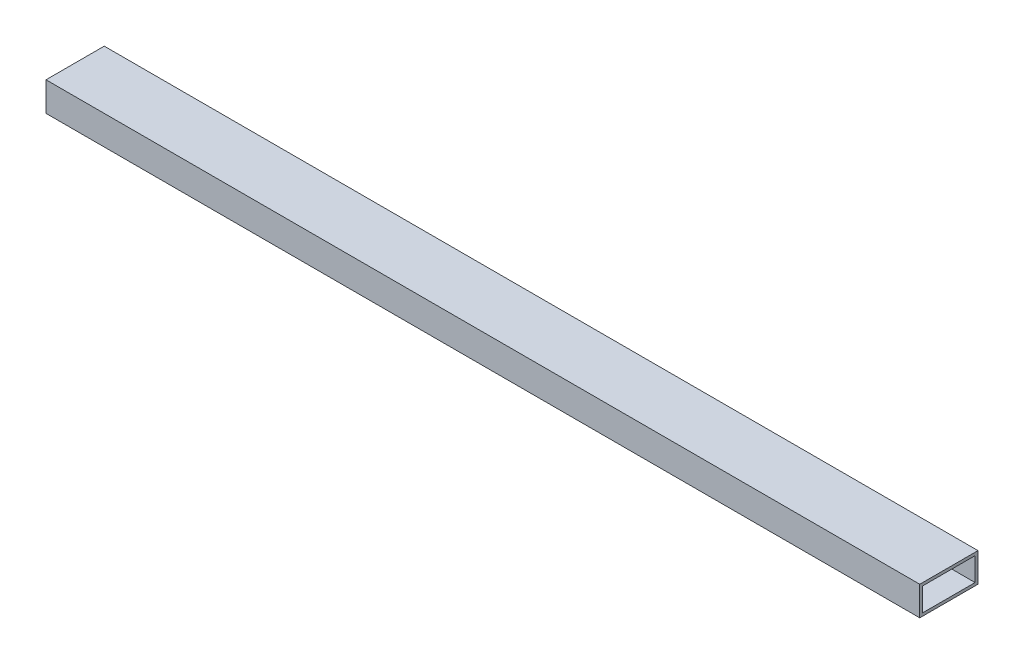
ISO-10303-21;
HEADER;
FILE_DESCRIPTION(('STEP AP214'),'2;1');
FILE_NAME('part.step','',(''),(''),'','','');
FILE_SCHEMA(('AUTOMOTIVE_DESIGN { 1 0 10303 214 1 1 1 1 }'));
ENDSEC;
DATA;
#1=APPLICATION_CONTEXT('core data for automotive mechanical design processes');
#2=APPLICATION_PROTOCOL_DEFINITION('international standard','automotive_design',2000,#1);
#3=PRODUCT_CONTEXT('',#1,'mechanical');
#4=PRODUCT('Part','Part','',(#3));
#5=PRODUCT_RELATED_PRODUCT_CATEGORY('part','',(#4));
#6=PRODUCT_DEFINITION_FORMATION('','',#4);
#7=PRODUCT_DEFINITION_CONTEXT('part definition',#1,'design');
#8=PRODUCT_DEFINITION('design','',#6,#7);
#9=PRODUCT_DEFINITION_SHAPE('','',#8);
#10=(LENGTH_UNIT() NAMED_UNIT(*) SI_UNIT(.MILLI.,.METRE.));
#11=(NAMED_UNIT(*) PLANE_ANGLE_UNIT() SI_UNIT($,.RADIAN.));
#12=(NAMED_UNIT(*) SI_UNIT($,.STERADIAN.) SOLID_ANGLE_UNIT());
#13=UNCERTAINTY_MEASURE_WITH_UNIT(LENGTH_MEASURE(1.E-05),#10,'distance_accuracy_value','');
#14=(GEOMETRIC_REPRESENTATION_CONTEXT(3) GLOBAL_UNCERTAINTY_ASSIGNED_CONTEXT((#13)) GLOBAL_UNIT_ASSIGNED_CONTEXT((#10,
#11,#12)) REPRESENTATION_CONTEXT('',''));
#15=CARTESIAN_POINT('',(0.,0.,0.));
#16=DIRECTION('',(0.,0.,1.));
#17=DIRECTION('',(1.,0.,0.));
#18=AXIS2_PLACEMENT_3D('',#15,#16,#17);
#19=CARTESIAN_POINT('',(300.,0.,0.));
#20=DIRECTION('',(-1.,0.,0.));
#21=DIRECTION('',(0.,0.,1.));
#22=AXIS2_PLACEMENT_3D('',#19,#20,#21);
#23=PLANE('',#22);
#24=DIRECTION('',(0.,1.,0.));
#25=VECTOR('',#24,1.);
#26=CARTESIAN_POINT('',(300.,-5.,-10.));
#27=LINE('',#26,#25);
#28=CARTESIAN_POINT('',(300.,-5.,-10.));
#29=VERTEX_POINT('',#28);
#30=CARTESIAN_POINT('',(300.,5.,-10.));
#31=VERTEX_POINT('',#30);
#32=EDGE_CURVE('E138',#29,#31,#27,.T.);
#33=ORIENTED_EDGE('',*,*,#32,.T.);
#34=DIRECTION('',(0.,0.,1.));
#35=VECTOR('',#34,1.);
#36=CARTESIAN_POINT('',(300.,5.,10.));
#37=LINE('',#36,#35);
#38=CARTESIAN_POINT('',(300.,5.,10.));
#39=VERTEX_POINT('',#38);
#40=EDGE_CURVE('E141',#31,#39,#37,.T.);
#41=ORIENTED_EDGE('',*,*,#40,.T.);
#42=DIRECTION('',(0.,-1.,0.));
#43=VECTOR('',#42,1.);
#44=CARTESIAN_POINT('',(300.,-5.,10.));
#45=LINE('',#44,#43);
#46=CARTESIAN_POINT('',(300.,-5.,10.));
#47=VERTEX_POINT('',#46);
#48=EDGE_CURVE('E144',#39,#47,#45,.T.);
#49=ORIENTED_EDGE('',*,*,#48,.T.);
#50=DIRECTION('',(0.,0.,-1.));
#51=VECTOR('',#50,1.);
#52=CARTESIAN_POINT('',(300.,-5.,10.));
#53=LINE('',#52,#51);
#54=EDGE_CURVE('E146',#47,#29,#53,.T.);
#55=ORIENTED_EDGE('',*,*,#54,.T.);
#56=EDGE_LOOP('',(#33,#41,#49,#55));
#57=FACE_BOUND('',#56,.T.);
#58=DIRECTION('',(0.,-1.,0.));
#59=VECTOR('',#58,1.);
#60=CARTESIAN_POINT('',(300.,-4.,9.));
#61=LINE('',#60,#59);
#62=CARTESIAN_POINT('',(300.,4.,9.));
#63=VERTEX_POINT('',#62);
#64=CARTESIAN_POINT('',(300.,-4.,9.));
#65=VERTEX_POINT('',#64);
#66=EDGE_CURVE('E102',#63,#65,#61,.T.);
#67=ORIENTED_EDGE('',*,*,#66,.F.);
#68=DIRECTION('',(0.,0.,1.));
#69=VECTOR('',#68,1.);
#70=CARTESIAN_POINT('',(300.,4.,9.));
#71=LINE('',#70,#69);
#72=CARTESIAN_POINT('',(300.,4.,-9.));
#73=VERTEX_POINT('',#72);
#74=EDGE_CURVE('E124',#73,#63,#71,.T.);
#75=ORIENTED_EDGE('',*,*,#74,.F.);
#76=DIRECTION('',(0.,1.,0.));
#77=VECTOR('',#76,1.);
#78=CARTESIAN_POINT('',(300.,-4.,-9.));
#79=LINE('',#78,#77);
#80=CARTESIAN_POINT('',(300.,-4.,-9.));
#81=VERTEX_POINT('',#80);
#82=EDGE_CURVE('E122',#81,#73,#79,.T.);
#83=ORIENTED_EDGE('',*,*,#82,.F.);
#84=DIRECTION('',(0.,0.,-1.));
#85=VECTOR('',#84,1.);
#86=CARTESIAN_POINT('',(300.,-4.,9.));
#87=LINE('',#86,#85);
#88=EDGE_CURVE('E110',#65,#81,#87,.T.);
#89=ORIENTED_EDGE('',*,*,#88,.F.);
#90=EDGE_LOOP('',(#67,#75,#83,#89));
#91=FACE_BOUND('',#90,.T.);
#92=ADVANCED_FACE('F37',(#57,#91),#23,.F.);
#93=CARTESIAN_POINT('',(0.,0.,0.));
#94=DIRECTION('',(-1.,0.,0.));
#95=DIRECTION('',(0.,0.,1.));
#96=AXIS2_PLACEMENT_3D('',#93,#94,#95);
#97=PLANE('',#96);
#98=DIRECTION('',(0.,1.,0.));
#99=VECTOR('',#98,1.);
#100=CARTESIAN_POINT('',(0.,-5.,-10.));
#101=LINE('',#100,#99);
#102=CARTESIAN_POINT('',(0.,-5.,-10.));
#103=VERTEX_POINT('',#102);
#104=CARTESIAN_POINT('',(0.,5.,-10.));
#105=VERTEX_POINT('',#104);
#106=EDGE_CURVE('E118',#103,#105,#101,.T.);
#107=ORIENTED_EDGE('',*,*,#106,.F.);
#108=DIRECTION('',(0.,0.,-1.));
#109=VECTOR('',#108,1.);
#110=CARTESIAN_POINT('',(0.,-5.,10.));
#111=LINE('',#110,#109);
#112=CARTESIAN_POINT('',(0.,-5.,10.));
#113=VERTEX_POINT('',#112);
#114=EDGE_CURVE('E142',#113,#103,#111,.T.);
#115=ORIENTED_EDGE('',*,*,#114,.F.);
#116=DIRECTION('',(0.,-1.,0.));
#117=VECTOR('',#116,1.);
#118=CARTESIAN_POINT('',(0.,-5.,10.));
#119=LINE('',#118,#117);
#120=CARTESIAN_POINT('',(0.,5.,10.));
#121=VERTEX_POINT('',#120);
#122=EDGE_CURVE('E153',#121,#113,#119,.T.);
#123=ORIENTED_EDGE('',*,*,#122,.F.);
#124=DIRECTION('',(0.,0.,1.));
#125=VECTOR('',#124,1.);
#126=CARTESIAN_POINT('',(0.,5.,10.));
#127=LINE('',#126,#125);
#128=EDGE_CURVE('E151',#105,#121,#127,.T.);
#129=ORIENTED_EDGE('',*,*,#128,.F.);
#130=EDGE_LOOP('',(#107,#115,#123,#129));
#131=FACE_BOUND('',#130,.T.);
#132=DIRECTION('',(0.,0.,1.));
#133=VECTOR('',#132,1.);
#134=CARTESIAN_POINT('',(0.,4.,9.));
#135=LINE('',#134,#133);
#136=CARTESIAN_POINT('',(0.,4.,-9.));
#137=VERTEX_POINT('',#136);
#138=CARTESIAN_POINT('',(0.,4.,9.));
#139=VERTEX_POINT('',#138);
#140=EDGE_CURVE('E111',#137,#139,#135,.T.);
#141=ORIENTED_EDGE('',*,*,#140,.T.);
#142=DIRECTION('',(0.,-1.,0.));
#143=VECTOR('',#142,1.);
#144=CARTESIAN_POINT('',(0.,-4.,9.));
#145=LINE('',#144,#143);
#146=CARTESIAN_POINT('',(0.,-4.,9.));
#147=VERTEX_POINT('',#146);
#148=EDGE_CURVE('E60',#139,#147,#145,.T.);
#149=ORIENTED_EDGE('',*,*,#148,.T.);
#150=DIRECTION('',(0.,0.,-1.));
#151=VECTOR('',#150,1.);
#152=CARTESIAN_POINT('',(0.,-4.,9.));
#153=LINE('',#152,#151);
#154=CARTESIAN_POINT('',(0.,-4.,-9.));
#155=VERTEX_POINT('',#154);
#156=EDGE_CURVE('E117',#147,#155,#153,.T.);
#157=ORIENTED_EDGE('',*,*,#156,.T.);
#158=DIRECTION('',(0.,1.,0.));
#159=VECTOR('',#158,1.);
#160=CARTESIAN_POINT('',(0.,-4.,-9.));
#161=LINE('',#160,#159);
#162=EDGE_CURVE('E130',#155,#137,#161,.T.);
#163=ORIENTED_EDGE('',*,*,#162,.T.);
#164=EDGE_LOOP('',(#141,#149,#157,#163));
#165=FACE_BOUND('',#164,.T.);
#166=ADVANCED_FACE('F171',(#131,#165),#97,.T.);
#167=CARTESIAN_POINT('',(300.,-5.,-10.));
#168=DIRECTION('',(0.,0.,1.));
#169=DIRECTION('',(1.,0.,0.));
#170=AXIS2_PLACEMENT_3D('',#167,#168,#169);
#171=PLANE('',#170);
#172=ORIENTED_EDGE('',*,*,#106,.T.);
#173=DIRECTION('',(-1.,0.,0.));
#174=VECTOR('',#173,1.);
#175=CARTESIAN_POINT('',(300.,5.,-10.));
#176=LINE('',#175,#174);
#177=EDGE_CURVE('E11',#31,#105,#176,.T.);
#178=ORIENTED_EDGE('',*,*,#177,.F.);
#179=ORIENTED_EDGE('',*,*,#32,.F.);
#180=DIRECTION('',(-1.,0.,0.));
#181=VECTOR('',#180,1.);
#182=CARTESIAN_POINT('',(300.,-5.,-10.));
#183=LINE('',#182,#181);
#184=EDGE_CURVE('E148',#29,#103,#183,.T.);
#185=ORIENTED_EDGE('',*,*,#184,.T.);
#186=EDGE_LOOP('',(#172,#178,#179,#185));
#187=FACE_BOUND('',#186,.T.);
#188=ADVANCED_FACE('F39',(#187),#171,.F.);
#189=CARTESIAN_POINT('',(300.,5.,10.));
#190=DIRECTION('',(0.,-1.,0.));
#191=DIRECTION('',(0.,0.,-1.));
#192=AXIS2_PLACEMENT_3D('',#189,#190,#191);
#193=PLANE('',#192);
#194=ORIENTED_EDGE('',*,*,#128,.T.);
#195=DIRECTION('',(-1.,0.,0.));
#196=VECTOR('',#195,1.);
#197=CARTESIAN_POINT('',(300.,5.,10.));
#198=LINE('',#197,#196);
#199=EDGE_CURVE('E45',#39,#121,#198,.T.);
#200=ORIENTED_EDGE('',*,*,#199,.F.);
#201=ORIENTED_EDGE('',*,*,#40,.F.);
#202=ORIENTED_EDGE('',*,*,#177,.T.);
#203=EDGE_LOOP('',(#194,#200,#201,#202));
#204=FACE_BOUND('',#203,.T.);
#205=ADVANCED_FACE('F181',(#204),#193,.F.);
#206=CARTESIAN_POINT('',(300.,-5.,10.));
#207=DIRECTION('',(0.,0.,-1.));
#208=DIRECTION('',(-1.,0.,0.));
#209=AXIS2_PLACEMENT_3D('',#206,#207,#208);
#210=PLANE('',#209);
#211=ORIENTED_EDGE('',*,*,#122,.T.);
#212=DIRECTION('',(-1.,0.,0.));
#213=VECTOR('',#212,1.);
#214=CARTESIAN_POINT('',(300.,-5.,10.));
#215=LINE('',#214,#213);
#216=EDGE_CURVE('E158',#47,#113,#215,.T.);
#217=ORIENTED_EDGE('',*,*,#216,.F.);
#218=ORIENTED_EDGE('',*,*,#48,.F.);
#219=ORIENTED_EDGE('',*,*,#199,.T.);
#220=EDGE_LOOP('',(#211,#217,#218,#219));
#221=FACE_BOUND('',#220,.T.);
#222=ADVANCED_FACE('F165',(#221),#210,.F.);
#223=CARTESIAN_POINT('',(300.,-5.,10.));
#224=DIRECTION('',(0.,1.,0.));
#225=DIRECTION('',(0.,0.,1.));
#226=AXIS2_PLACEMENT_3D('',#223,#224,#225);
#227=PLANE('',#226);
#228=ORIENTED_EDGE('',*,*,#114,.T.);
#229=ORIENTED_EDGE('',*,*,#184,.F.);
#230=ORIENTED_EDGE('',*,*,#54,.F.);
#231=ORIENTED_EDGE('',*,*,#216,.T.);
#232=EDGE_LOOP('',(#228,#229,#230,#231));
#233=FACE_BOUND('',#232,.T.);
#234=ADVANCED_FACE('F175',(#233),#227,.F.);
#235=CARTESIAN_POINT('',(300.,-4.,9.));
#236=DIRECTION('',(0.,0.,-1.));
#237=DIRECTION('',(-1.,0.,0.));
#238=AXIS2_PLACEMENT_3D('',#235,#236,#237);
#239=PLANE('',#238);
#240=ORIENTED_EDGE('',*,*,#148,.F.);
#241=DIRECTION('',(-1.,0.,0.));
#242=VECTOR('',#241,1.);
#243=CARTESIAN_POINT('',(300.,4.,9.));
#244=LINE('',#243,#242);
#245=EDGE_CURVE('E106',#63,#139,#244,.T.);
#246=ORIENTED_EDGE('',*,*,#245,.F.);
#247=ORIENTED_EDGE('',*,*,#66,.T.);
#248=DIRECTION('',(-1.,0.,0.));
#249=VECTOR('',#248,1.);
#250=CARTESIAN_POINT('',(300.,-4.,9.));
#251=LINE('',#250,#249);
#252=EDGE_CURVE('E105',#65,#147,#251,.T.);
#253=ORIENTED_EDGE('',*,*,#252,.T.);
#254=EDGE_LOOP('',(#240,#246,#247,#253));
#255=FACE_BOUND('',#254,.T.);
#256=ADVANCED_FACE('F104',(#255),#239,.T.);
#257=CARTESIAN_POINT('',(300.,-4.,9.));
#258=DIRECTION('',(0.,1.,0.));
#259=DIRECTION('',(0.,0.,1.));
#260=AXIS2_PLACEMENT_3D('',#257,#258,#259);
#261=PLANE('',#260);
#262=ORIENTED_EDGE('',*,*,#156,.F.);
#263=ORIENTED_EDGE('',*,*,#252,.F.);
#264=ORIENTED_EDGE('',*,*,#88,.T.);
#265=DIRECTION('',(-1.,0.,0.));
#266=VECTOR('',#265,1.);
#267=CARTESIAN_POINT('',(300.,-4.,-9.));
#268=LINE('',#267,#266);
#269=EDGE_CURVE('E119',#81,#155,#268,.T.);
#270=ORIENTED_EDGE('',*,*,#269,.T.);
#271=EDGE_LOOP('',(#262,#263,#264,#270));
#272=FACE_BOUND('',#271,.T.);
#273=ADVANCED_FACE('F114',(#272),#261,.T.);
#274=CARTESIAN_POINT('',(300.,-4.,-9.));
#275=DIRECTION('',(0.,0.,1.));
#276=DIRECTION('',(1.,0.,0.));
#277=AXIS2_PLACEMENT_3D('',#274,#275,#276);
#278=PLANE('',#277);
#279=ORIENTED_EDGE('',*,*,#162,.F.);
#280=ORIENTED_EDGE('',*,*,#269,.F.);
#281=ORIENTED_EDGE('',*,*,#82,.T.);
#282=DIRECTION('',(-1.,0.,0.));
#283=VECTOR('',#282,1.);
#284=CARTESIAN_POINT('',(300.,4.,-9.));
#285=LINE('',#284,#283);
#286=EDGE_CURVE('E52',#73,#137,#285,.T.);
#287=ORIENTED_EDGE('',*,*,#286,.T.);
#288=EDGE_LOOP('',(#279,#280,#281,#287));
#289=FACE_BOUND('',#288,.T.);
#290=ADVANCED_FACE('F204',(#289),#278,.T.);
#291=CARTESIAN_POINT('',(300.,4.,9.));
#292=DIRECTION('',(0.,-1.,0.));
#293=DIRECTION('',(0.,0.,-1.));
#294=AXIS2_PLACEMENT_3D('',#291,#292,#293);
#295=PLANE('',#294);
#296=ORIENTED_EDGE('',*,*,#140,.F.);
#297=ORIENTED_EDGE('',*,*,#286,.F.);
#298=ORIENTED_EDGE('',*,*,#74,.T.);
#299=ORIENTED_EDGE('',*,*,#245,.T.);
#300=EDGE_LOOP('',(#296,#297,#298,#299));
#301=FACE_BOUND('',#300,.T.);
#302=ADVANCED_FACE('F208',(#301),#295,.T.);
#303=CLOSED_SHELL('',(#92,#166,#188,#205,#222,#234,#256,#273,#290,#302));
#304=MANIFOLD_SOLID_BREP('B2',#303);
#305=ADVANCED_BREP_SHAPE_REPRESENTATION('',(#18,#304),#14);
#306=SHAPE_DEFINITION_REPRESENTATION(#9,#305);
ENDSEC;
END-ISO-10303-21;
